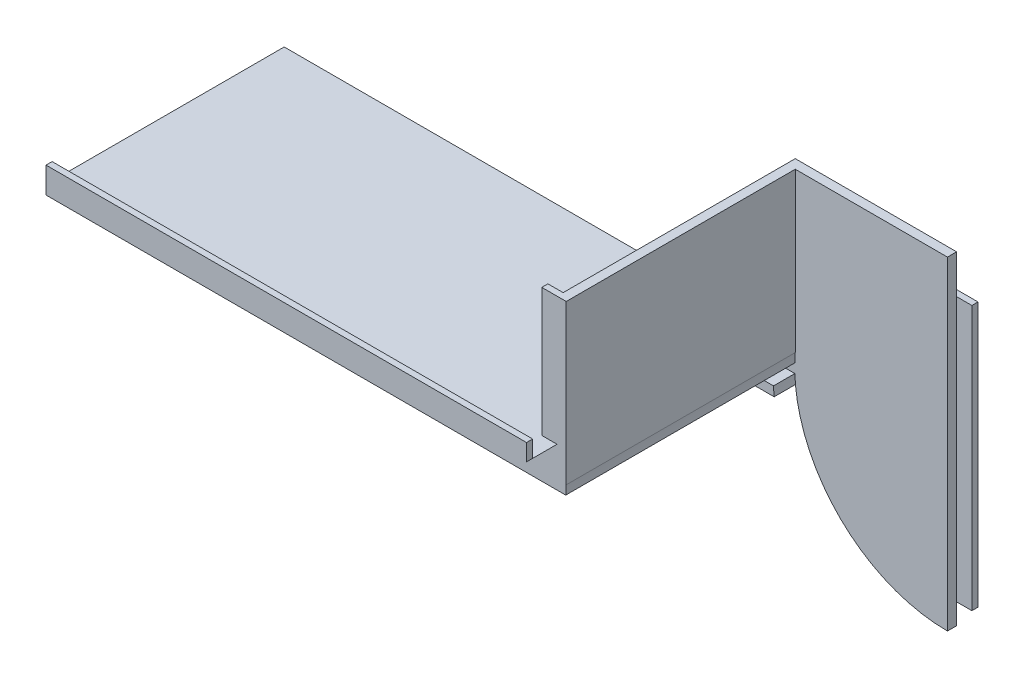
ISO-10303-21;
HEADER;
FILE_DESCRIPTION(('STEP AP214'),'2;1');
FILE_NAME('part.step','',(''),(''),'','','');
FILE_SCHEMA(('AUTOMOTIVE_DESIGN { 1 0 10303 214 1 1 1 1 }'));
ENDSEC;
DATA;
#1=APPLICATION_CONTEXT('core data for automotive mechanical design processes');
#2=APPLICATION_PROTOCOL_DEFINITION('international standard','automotive_design',2000,#1);
#3=PRODUCT_CONTEXT('',#1,'mechanical');
#4=PRODUCT('Part','Part','',(#3));
#5=PRODUCT_RELATED_PRODUCT_CATEGORY('part','',(#4));
#6=PRODUCT_DEFINITION_FORMATION('','',#4);
#7=PRODUCT_DEFINITION_CONTEXT('part definition',#1,'design');
#8=PRODUCT_DEFINITION('design','',#6,#7);
#9=PRODUCT_DEFINITION_SHAPE('','',#8);
#10=(LENGTH_UNIT() NAMED_UNIT(*) SI_UNIT(.MILLI.,.METRE.));
#11=(NAMED_UNIT(*) PLANE_ANGLE_UNIT() SI_UNIT($,.RADIAN.));
#12=(NAMED_UNIT(*) SI_UNIT($,.STERADIAN.) SOLID_ANGLE_UNIT());
#13=UNCERTAINTY_MEASURE_WITH_UNIT(LENGTH_MEASURE(1.E-05),#10,'distance_accuracy_value','');
#14=(GEOMETRIC_REPRESENTATION_CONTEXT(3) GLOBAL_UNCERTAINTY_ASSIGNED_CONTEXT((#13)) GLOBAL_UNIT_ASSIGNED_CONTEXT((#10,
#11,#12)) REPRESENTATION_CONTEXT('',''));
#15=CARTESIAN_POINT('',(0.,0.,0.));
#16=DIRECTION('',(0.,0.,1.));
#17=DIRECTION('',(1.,0.,0.));
#18=AXIS2_PLACEMENT_3D('',#15,#16,#17);
#19=CARTESIAN_POINT('',(0.,0.,-131.));
#20=DIRECTION('',(0.,0.,1.));
#21=DIRECTION('',(1.,0.,0.));
#22=AXIS2_PLACEMENT_3D('',#19,#20,#21);
#23=CYLINDRICAL_SURFACE('',#22,50.);
#24=DIRECTION('',(0.,0.,1.));
#25=VECTOR('',#24,1.);
#26=CARTESIAN_POINT('',(-49.749371855331,-5.,-131.));
#27=LINE('',#26,#25);
#28=CARTESIAN_POINT('',(-49.749371855331,-5.,-128.));
#29=VERTEX_POINT('',#28);
#30=CARTESIAN_POINT('',(-49.749371855331,-5.,-121.));
#31=VERTEX_POINT('',#30);
#32=EDGE_CURVE('E233',#29,#31,#27,.T.);
#33=ORIENTED_EDGE('',*,*,#32,.F.);
#34=CARTESIAN_POINT('',(0.,0.,-128.));
#35=DIRECTION('',(0.,0.,-1.));
#36=DIRECTION('',(-1.,0.,0.));
#37=AXIS2_PLACEMENT_3D('',#34,#35,#36);
#38=CIRCLE('',#37,50.);
#39=CARTESIAN_POINT('',(-49.9599839871872,-2.,-128.));
#40=VERTEX_POINT('',#39);
#41=EDGE_CURVE('E230',#40,#29,#38,.F.);
#42=ORIENTED_EDGE('',*,*,#41,.F.);
#43=DIRECTION('',(0.,0.,1.));
#44=VECTOR('',#43,1.);
#45=CARTESIAN_POINT('',(-49.9599839871872,-2.,-131.));
#46=LINE('',#45,#44);
#47=CARTESIAN_POINT('',(-49.9599839871872,-2.,-121.));
#48=VERTEX_POINT('',#47);
#49=EDGE_CURVE('E247',#40,#48,#46,.T.);
#50=ORIENTED_EDGE('',*,*,#49,.T.);
#51=CARTESIAN_POINT('',(0.,0.,-121.));
#52=DIRECTION('',(0.,0.,-1.));
#53=DIRECTION('',(1.,0.,0.));
#54=AXIS2_PLACEMENT_3D('',#51,#52,#53);
#55=CIRCLE('',#54,50.);
#56=EDGE_CURVE('E281',#31,#48,#55,.T.);
#57=ORIENTED_EDGE('',*,*,#56,.F.);
#58=EDGE_LOOP('',(#33,#42,#50,#57));
#59=FACE_BOUND('',#58,.T.);
#60=ADVANCED_FACE('F44',(#59),#23,.F.);
#61=CARTESIAN_POINT('',(0.,0.,-272.562777593547));
#62=DIRECTION('',(0.,0.,1.));
#63=DIRECTION('',(1.,0.,0.));
#64=AXIS2_PLACEMENT_3D('',#61,#62,#63);
#65=CYLINDRICAL_SURFACE('',#64,50.05);
#66=CARTESIAN_POINT('',(0.,0.,-128.));
#67=DIRECTION('',(0.,0.,-1.));
#68=DIRECTION('',(-1.,0.,0.));
#69=AXIS2_PLACEMENT_3D('',#66,#67,#68);
#70=CIRCLE('',#69,50.05);
#71=CARTESIAN_POINT('',(-49.7996234925526,-5.,-128.));
#72=VERTEX_POINT('',#71);
#73=CARTESIAN_POINT('',(0.,-50.05,-128.));
#74=VERTEX_POINT('',#73);
#75=EDGE_CURVE('E212',#72,#74,#70,.F.);
#76=ORIENTED_EDGE('',*,*,#75,.F.);
#77=DIRECTION('',(0.,0.,1.));
#78=VECTOR('',#77,1.);
#79=CARTESIAN_POINT('',(-49.7996234925526,-5.,-272.562777593547));
#80=LINE('',#79,#78);
#81=CARTESIAN_POINT('',(-49.7996234925526,-5.,-131.));
#82=VERTEX_POINT('',#81);
#83=EDGE_CURVE('E217',#72,#82,#80,.F.);
#84=ORIENTED_EDGE('',*,*,#83,.T.);
#85=CARTESIAN_POINT('',(0.,0.,-131.));
#86=DIRECTION('',(0.,0.,-1.));
#87=DIRECTION('',(-1.,0.,0.));
#88=AXIS2_PLACEMENT_3D('',#85,#86,#87);
#89=CIRCLE('',#88,50.05);
#90=CARTESIAN_POINT('',(0.,-50.05,-131.));
#91=VERTEX_POINT('',#90);
#92=EDGE_CURVE('E223',#91,#82,#89,.T.);
#93=ORIENTED_EDGE('',*,*,#92,.F.);
#94=DIRECTION('',(0.,0.,1.));
#95=VECTOR('',#94,1.);
#96=CARTESIAN_POINT('',(0.,-50.05,-272.562777593547));
#97=LINE('',#96,#95);
#98=EDGE_CURVE('E220',#91,#74,#97,.T.);
#99=ORIENTED_EDGE('',*,*,#98,.T.);
#100=EDGE_LOOP('',(#76,#84,#93,#99));
#101=FACE_BOUND('',#100,.T.);
#102=ADVANCED_FACE('F214',(#101),#65,.T.);
#103=CARTESIAN_POINT('',(0.,0.,-121.));
#104=DIRECTION('',(0.,0.,1.));
#105=DIRECTION('',(1.,0.,0.));
#106=AXIS2_PLACEMENT_3D('',#103,#104,#105);
#107=PLANE('',#106);
#108=DIRECTION('',(-1.,0.,0.));
#109=VECTOR('',#108,1.);
#110=CARTESIAN_POINT('',(5.00100000000001,-5.,-121.));
#111=LINE('',#110,#109);
#112=CARTESIAN_POINT('',(-220.183732216023,-5.,-121.));
#113=VERTEX_POINT('',#112);
#114=EDGE_CURVE('E60',#31,#113,#111,.T.);
#115=ORIENTED_EDGE('',*,*,#114,.F.);
#116=ORIENTED_EDGE('',*,*,#56,.T.);
#117=DIRECTION('',(-1.,0.,0.));
#118=VECTOR('',#117,1.);
#119=CARTESIAN_POINT('',(5.00100000000001,-2.,-121.));
#120=LINE('',#119,#118);
#121=CARTESIAN_POINT('',(-220.183732216023,-2.,-121.));
#122=VERTEX_POINT('',#121);
#123=EDGE_CURVE('E253',#48,#122,#120,.T.);
#124=ORIENTED_EDGE('',*,*,#123,.T.);
#125=DIRECTION('',(0.,-1.,0.));
#126=VECTOR('',#125,1.);
#127=CARTESIAN_POINT('',(-220.183732216023,-3.,-121.));
#128=LINE('',#127,#126);
#129=EDGE_CURVE('E279',#122,#113,#128,.T.);
#130=ORIENTED_EDGE('',*,*,#129,.T.);
#131=EDGE_LOOP('',(#115,#116,#124,#130));
#132=FACE_BOUND('',#131,.T.);
#133=ADVANCED_FACE('F464',(#132),#107,.T.);
#134=CARTESIAN_POINT('',(-52.8397431775085,341.294854205715,134.));
#135=DIRECTION('',(1.,0.,0.));
#136=DIRECTION('',(0.,0.,-1.));
#137=AXIS2_PLACEMENT_3D('',#134,#135,#136);
#138=PLANE('',#137);
#139=DIRECTION('',(0.,-1.,0.));
#140=VECTOR('',#139,1.);
#141=CARTESIAN_POINT('',(-52.8397431775085,56.,-55.));
#142=LINE('',#141,#140);
#143=CARTESIAN_POINT('',(-52.8397431775085,56.,-55.));
#144=VERTEX_POINT('',#143);
#145=CARTESIAN_POINT('',(-52.8397431775085,14.0000000000001,-55.));
#146=VERTEX_POINT('',#145);
#147=EDGE_CURVE('E68',#144,#146,#142,.T.);
#148=ORIENTED_EDGE('',*,*,#147,.F.);
#149=DIRECTION('',(0.,0.,-1.));
#150=VECTOR('',#149,1.);
#151=CARTESIAN_POINT('',(-52.8397431775085,56.,134.));
#152=LINE('',#151,#150);
#153=CARTESIAN_POINT('',(-52.8397431775085,56.,-131.));
#154=VERTEX_POINT('',#153);
#155=EDGE_CURVE('E372',#144,#154,#152,.T.);
#156=ORIENTED_EDGE('',*,*,#155,.T.);
#157=DIRECTION('',(0.,-1.,0.));
#158=VECTOR('',#157,1.);
#159=CARTESIAN_POINT('',(-52.8397431775085,341.294854205715,-131.));
#160=LINE('',#159,#158);
#161=CARTESIAN_POINT('',(-52.8397431775085,14.0000000000001,-131.));
#162=VERTEX_POINT('',#161);
#163=EDGE_CURVE('E384',#154,#162,#160,.T.);
#164=ORIENTED_EDGE('',*,*,#163,.T.);
#165=DIRECTION('',(0.,0.,1.));
#166=VECTOR('',#165,1.);
#167=CARTESIAN_POINT('',(-52.8397431775085,14.0000000000001,-11.5));
#168=LINE('',#167,#166);
#169=EDGE_CURVE('E399',#162,#146,#168,.T.);
#170=ORIENTED_EDGE('',*,*,#169,.T.);
#171=EDGE_LOOP('',(#148,#156,#164,#170));
#172=FACE_BOUND('',#171,.T.);
#173=ADVANCED_FACE('F466',(#172),#138,.F.);
#174=CARTESIAN_POINT('',(0.,4.,0.));
#175=DIRECTION('',(0.,-1.,0.));
#176=DIRECTION('',(0.,0.,-1.));
#177=AXIS2_PLACEMENT_3D('',#174,#175,#176);
#178=PLANE('',#177);
#179=DIRECTION('',(0.,0.,1.));
#180=VECTOR('',#179,1.);
#181=CARTESIAN_POINT('',(-220.183732216023,4.,-9.99999999999999));
#182=LINE('',#181,#180);
#183=CARTESIAN_POINT('',(-220.183732216023,4.,-131.));
#184=VERTEX_POINT('',#183);
#185=CARTESIAN_POINT('',(-220.183732216023,4.,-55.));
#186=VERTEX_POINT('',#185);
#187=EDGE_CURVE('E397',#184,#186,#182,.T.);
#188=ORIENTED_EDGE('',*,*,#187,.T.);
#189=DIRECTION('',(1.,0.,0.));
#190=VECTOR('',#189,1.);
#191=CARTESIAN_POINT('',(0.,4.,-55.));
#192=LINE('',#191,#190);
#193=CARTESIAN_POINT('',(-62.8397431775084,4.,-55.));
#194=VERTEX_POINT('',#193);
#195=EDGE_CURVE('E300',#186,#194,#192,.T.);
#196=ORIENTED_EDGE('',*,*,#195,.T.);
#197=DIRECTION('',(0.,0.,-1.));
#198=VECTOR('',#197,1.);
#199=CARTESIAN_POINT('',(-62.8397431775084,4.,-131.));
#200=LINE('',#199,#198);
#201=CARTESIAN_POINT('',(-62.8397431775084,4.,-131.));
#202=VERTEX_POINT('',#201);
#203=EDGE_CURVE('E401',#194,#202,#200,.T.);
#204=ORIENTED_EDGE('',*,*,#203,.T.);
#205=DIRECTION('',(-1.,0.,0.));
#206=VECTOR('',#205,1.);
#207=CARTESIAN_POINT('',(-39.7994974842648,4.,-131.));
#208=LINE('',#207,#206);
#209=EDGE_CURVE('E392',#202,#184,#208,.T.);
#210=ORIENTED_EDGE('',*,*,#209,.T.);
#211=EDGE_LOOP('',(#188,#196,#204,#210));
#212=FACE_BOUND('',#211,.T.);
#213=ADVANCED_FACE('F473',(#212),#178,.F.);
#214=DIRECTION('',(0.,0.,1.));
#215=VECTOR('',#214,1.);
#216=CARTESIAN_POINT('',(-49.8397431775085,4.,-131.));
#217=LINE('',#216,#215);
#218=CARTESIAN_POINT('',(-49.8397431775085,4.,-53.));
#219=VERTEX_POINT('',#218);
#220=CARTESIAN_POINT('',(-49.8397431775085,4.,-128.));
#221=VERTEX_POINT('',#220);
#222=EDGE_CURVE('E383',#219,#221,#217,.F.);
#223=ORIENTED_EDGE('',*,*,#222,.F.);
#224=CARTESIAN_POINT('',(0.,0.,-53.));
#225=DIRECTION('',(0.,0.,-1.));
#226=DIRECTION('',(0.,1.,0.));
#227=AXIS2_PLACEMENT_3D('',#224,#225,#226);
#228=CIRCLE('',#227,50.);
#229=CARTESIAN_POINT('',(-49.9899989998,1.,-53.));
#230=VERTEX_POINT('',#229);
#231=EDGE_CURVE('E307',#219,#230,#228,.F.);
#232=ORIENTED_EDGE('',*,*,#231,.T.);
#233=DIRECTION('',(0.,0.,1.));
#234=VECTOR('',#233,1.);
#235=CARTESIAN_POINT('',(-49.9899989998,1.,-131.));
#236=LINE('',#235,#234);
#237=CARTESIAN_POINT('',(-49.9899989998,1.,-128.));
#238=VERTEX_POINT('',#237);
#239=EDGE_CURVE('E324',#230,#238,#236,.F.);
#240=ORIENTED_EDGE('',*,*,#239,.T.);
#241=EDGE_CURVE('E371',#221,#238,#38,.F.);
#242=ORIENTED_EDGE('',*,*,#241,.F.);
#243=EDGE_LOOP('',(#223,#232,#240,#242));
#244=FACE_BOUND('',#243,.T.);
#245=ADVANCED_FACE('F445',(#244),#23,.F.);
#246=CARTESIAN_POINT('',(-49.8397431775085,341.294854205715,131.));
#247=DIRECTION('',(-1.,0.,0.));
#248=DIRECTION('',(0.,0.,1.));
#249=AXIS2_PLACEMENT_3D('',#246,#247,#248);
#250=PLANE('',#249);
#251=DIRECTION('',(0.,0.,1.));
#252=VECTOR('',#251,1.);
#253=CARTESIAN_POINT('',(-49.8397431775085,56.,131.));
#254=LINE('',#253,#252);
#255=CARTESIAN_POINT('',(-49.8397431775085,56.,-128.));
#256=VERTEX_POINT('',#255);
#257=CARTESIAN_POINT('',(-49.8397431775085,56.,-53.));
#258=VERTEX_POINT('',#257);
#259=EDGE_CURVE('E380',#256,#258,#254,.T.);
#260=ORIENTED_EDGE('',*,*,#259,.T.);
#261=DIRECTION('',(0.,-1.,0.));
#262=VECTOR('',#261,1.);
#263=CARTESIAN_POINT('',(-49.8397431775085,341.294854205715,-53.));
#264=LINE('',#263,#262);
#265=EDGE_CURVE('E310',#258,#219,#264,.T.);
#266=ORIENTED_EDGE('',*,*,#265,.T.);
#267=ORIENTED_EDGE('',*,*,#222,.T.);
#268=DIRECTION('',(0.,-1.,0.));
#269=VECTOR('',#268,1.);
#270=CARTESIAN_POINT('',(-49.8397431775085,341.294854205715,-128.));
#271=LINE('',#270,#269);
#272=EDGE_CURVE('E375',#256,#221,#271,.T.);
#273=ORIENTED_EDGE('',*,*,#272,.F.);
#274=EDGE_LOOP('',(#260,#266,#267,#273));
#275=FACE_BOUND('',#274,.T.);
#276=ADVANCED_FACE('F442',(#275),#250,.F.);
#277=CARTESIAN_POINT('',(-220.183732216023,4.,-9.99999999999999));
#278=DIRECTION('',(1.,0.,0.));
#279=DIRECTION('',(0.,0.,-1.));
#280=AXIS2_PLACEMENT_3D('',#277,#278,#279);
#281=PLANE('',#280);
#282=DIRECTION('',(0.,-1.,0.));
#283=VECTOR('',#282,1.);
#284=CARTESIAN_POINT('',(-220.183732216023,4.,-131.));
#285=LINE('',#284,#283);
#286=CARTESIAN_POINT('',(-220.183732216023,-5.,-131.));
#287=VERTEX_POINT('',#286);
#288=EDGE_CURVE('E394',#184,#287,#285,.T.);
#289=ORIENTED_EDGE('',*,*,#288,.T.);
#290=DIRECTION('',(0.,0.,-1.));
#291=VECTOR('',#290,1.);
#292=CARTESIAN_POINT('',(-220.183732216023,-5.,-121.));
#293=LINE('',#292,#291);
#294=EDGE_CURVE('E239',#113,#287,#293,.T.);
#295=ORIENTED_EDGE('',*,*,#294,.F.);
#296=ORIENTED_EDGE('',*,*,#129,.F.);
#297=DIRECTION('',(0.,0.,-1.));
#298=VECTOR('',#297,1.);
#299=CARTESIAN_POINT('',(-220.183732216023,-2.,-128.));
#300=LINE('',#299,#298);
#301=CARTESIAN_POINT('',(-220.183732216023,-2.,-128.));
#302=VERTEX_POINT('',#301);
#303=EDGE_CURVE('E246',#122,#302,#300,.T.);
#304=ORIENTED_EDGE('',*,*,#303,.T.);
#305=DIRECTION('',(0.,1.,0.));
#306=VECTOR('',#305,1.);
#307=CARTESIAN_POINT('',(-220.183732216023,-5.,-128.));
#308=LINE('',#307,#306);
#309=CARTESIAN_POINT('',(-220.183732216023,1.,-128.));
#310=VERTEX_POINT('',#309);
#311=EDGE_CURVE('E390',#302,#310,#308,.T.);
#312=ORIENTED_EDGE('',*,*,#311,.T.);
#313=DIRECTION('',(0.,0.,-1.));
#314=VECTOR('',#313,1.);
#315=CARTESIAN_POINT('',(-220.183732216023,1.,-128.));
#316=LINE('',#315,#314);
#317=CARTESIAN_POINT('',(-220.183732216023,1.,-53.));
#318=VERTEX_POINT('',#317);
#319=EDGE_CURVE('E318',#318,#310,#316,.T.);
#320=ORIENTED_EDGE('',*,*,#319,.F.);
#321=DIRECTION('',(0.,-1.,0.));
#322=VECTOR('',#321,1.);
#323=CARTESIAN_POINT('',(-220.183732216023,73.0673728266014,-53.));
#324=LINE('',#323,#322);
#325=CARTESIAN_POINT('',(-220.183732216023,9.5,-53.));
#326=VERTEX_POINT('',#325);
#327=EDGE_CURVE('E305',#326,#318,#324,.T.);
#328=ORIENTED_EDGE('',*,*,#327,.F.);
#329=DIRECTION('',(0.,0.,1.));
#330=VECTOR('',#329,1.);
#331=CARTESIAN_POINT('',(-220.183732216023,9.5,-55.));
#332=LINE('',#331,#330);
#333=CARTESIAN_POINT('',(-220.183732216023,9.5,-55.));
#334=VERTEX_POINT('',#333);
#335=EDGE_CURVE('E297',#334,#326,#332,.T.);
#336=ORIENTED_EDGE('',*,*,#335,.F.);
#337=DIRECTION('',(0.,-1.,0.));
#338=VECTOR('',#337,1.);
#339=CARTESIAN_POINT('',(-220.183732216023,2.5,-55.));
#340=LINE('',#339,#338);
#341=EDGE_CURVE('E284',#334,#186,#340,.T.);
#342=ORIENTED_EDGE('',*,*,#341,.T.);
#343=ORIENTED_EDGE('',*,*,#187,.F.);
#344=EDGE_LOOP('',(#289,#295,#296,#304,#312,#320,#328,#336,#342,#343));
#345=FACE_BOUND('',#344,.T.);
#346=ADVANCED_FACE('F453',(#345),#281,.F.);
#347=CARTESIAN_POINT('',(0.,0.,-131.));
#348=DIRECTION('',(0.,0.,-1.));
#349=DIRECTION('',(-1.,0.,0.));
#350=AXIS2_PLACEMENT_3D('',#347,#348,#349);
#351=PLANE('',#350);
#352=ORIENTED_EDGE('',*,*,#92,.T.);
#353=DIRECTION('',(-1.,0.,0.));
#354=VECTOR('',#353,1.);
#355=CARTESIAN_POINT('',(5.00100000000001,-5.,-131.));
#356=LINE('',#355,#354);
#357=EDGE_CURVE('E238',#82,#287,#356,.T.);
#358=ORIENTED_EDGE('',*,*,#357,.T.);
#359=ORIENTED_EDGE('',*,*,#288,.F.);
#360=ORIENTED_EDGE('',*,*,#209,.F.);
#361=DIRECTION('',(-0.707106781186544,-0.707106781186551,0.));
#362=VECTOR('',#361,1.);
#363=CARTESIAN_POINT('',(-52.8397431775085,14.0000000000001,-131.));
#364=LINE('',#363,#362);
#365=EDGE_CURVE('E405',#202,#162,#364,.F.);
#366=ORIENTED_EDGE('',*,*,#365,.T.);
#367=ORIENTED_EDGE('',*,*,#163,.F.);
#368=DIRECTION('',(1.,0.,0.));
#369=VECTOR('',#368,1.);
#370=CARTESIAN_POINT('',(-52.8397431775085,56.,-131.));
#371=LINE('',#370,#369);
#372=CARTESIAN_POINT('',(0.,56.,-131.));
#373=VERTEX_POINT('',#372);
#374=EDGE_CURVE('E374',#154,#373,#371,.T.);
#375=ORIENTED_EDGE('',*,*,#374,.T.);
#376=DIRECTION('',(0.,-1.,0.));
#377=VECTOR('',#376,1.);
#378=CARTESIAN_POINT('',(0.,104.286511517215,-131.));
#379=LINE('',#378,#377);
#380=CARTESIAN_POINT('',(0.,43.2830241784648,-131.));
#381=VERTEX_POINT('',#380);
#382=EDGE_CURVE('E361',#373,#381,#379,.T.);
#383=ORIENTED_EDGE('',*,*,#382,.T.);
#384=DIRECTION('',(1.,0.,0.));
#385=VECTOR('',#384,1.);
#386=CARTESIAN_POINT('',(5.,43.2830241784648,-131.));
#387=LINE('',#386,#385);
#388=CARTESIAN_POINT('',(-3.,43.2830241784648,-131.));
#389=VERTEX_POINT('',#388);
#390=EDGE_CURVE('E331',#389,#381,#387,.T.);
#391=ORIENTED_EDGE('',*,*,#390,.F.);
#392=DIRECTION('',(0.,1.,0.));
#393=VECTOR('',#392,1.);
#394=CARTESIAN_POINT('',(-3.,43.2830241784648,-131.));
#395=LINE('',#394,#393);
#396=CARTESIAN_POINT('',(-3.00000000000001,-43.2830241784648,-131.));
#397=VERTEX_POINT('',#396);
#398=EDGE_CURVE('E343',#397,#389,#395,.T.);
#399=ORIENTED_EDGE('',*,*,#398,.F.);
#400=DIRECTION('',(-1.,0.,0.));
#401=VECTOR('',#400,1.);
#402=CARTESIAN_POINT('',(5.,-43.2830241784648,-131.));
#403=LINE('',#402,#401);
#404=CARTESIAN_POINT('',(0.,-43.2830241784649,-131.));
#405=VERTEX_POINT('',#404);
#406=EDGE_CURVE('E53',#405,#397,#403,.T.);
#407=ORIENTED_EDGE('',*,*,#406,.F.);
#408=EDGE_CURVE('E360',#405,#91,#379,.T.);
#409=ORIENTED_EDGE('',*,*,#408,.T.);
#410=EDGE_LOOP('',(#352,#358,#359,#360,#366,#367,#375,#383,#391,#399,#407,#409));
#411=FACE_BOUND('',#410,.T.);
#412=ADVANCED_FACE('F430',(#411),#351,.T.);
#413=CARTESIAN_POINT('',(220.183732216023,-5.,-128.));
#414=DIRECTION('',(0.,0.,-1.));
#415=DIRECTION('',(-1.,0.,0.));
#416=AXIS2_PLACEMENT_3D('',#413,#414,#415);
#417=PLANE('',#416);
#418=ORIENTED_EDGE('',*,*,#41,.T.);
#419=DIRECTION('',(1.,0.,0.));
#420=VECTOR('',#419,1.);
#421=CARTESIAN_POINT('',(-53.091204109623,-5.,-128.));
#422=LINE('',#421,#420);
#423=EDGE_CURVE('E227',#72,#29,#422,.T.);
#424=ORIENTED_EDGE('',*,*,#423,.F.);
#425=ORIENTED_EDGE('',*,*,#75,.T.);
#426=DIRECTION('',(0.,1.,0.));
#427=VECTOR('',#426,1.);
#428=CARTESIAN_POINT('',(0.,-5.,-128.));
#429=LINE('',#428,#427);
#430=CARTESIAN_POINT('',(0.,56.,-128.));
#431=VERTEX_POINT('',#430);
#432=EDGE_CURVE('E364',#74,#431,#429,.T.);
#433=ORIENTED_EDGE('',*,*,#432,.T.);
#434=DIRECTION('',(-1.,0.,0.));
#435=VECTOR('',#434,1.);
#436=CARTESIAN_POINT('',(-49.8397431775085,56.,-128.));
#437=LINE('',#436,#435);
#438=EDGE_CURVE('E378',#431,#256,#437,.T.);
#439=ORIENTED_EDGE('',*,*,#438,.T.);
#440=ORIENTED_EDGE('',*,*,#272,.T.);
#441=ORIENTED_EDGE('',*,*,#241,.T.);
#442=DIRECTION('',(-1.,0.,0.));
#443=VECTOR('',#442,1.);
#444=CARTESIAN_POINT('',(5.,1.,-128.));
#445=LINE('',#444,#443);
#446=EDGE_CURVE('E321',#238,#310,#445,.T.);
#447=ORIENTED_EDGE('',*,*,#446,.T.);
#448=ORIENTED_EDGE('',*,*,#311,.F.);
#449=DIRECTION('',(-1.,0.,0.));
#450=VECTOR('',#449,1.);
#451=CARTESIAN_POINT('',(5.00100000000001,-2.,-128.));
#452=LINE('',#451,#450);
#453=EDGE_CURVE('E250',#40,#302,#452,.T.);
#454=ORIENTED_EDGE('',*,*,#453,.F.);
#455=EDGE_LOOP('',(#418,#424,#425,#433,#439,#440,#441,#447,#448,#454));
#456=FACE_BOUND('',#455,.T.);
#457=ADVANCED_FACE('F228',(#456),#417,.F.);
#458=CARTESIAN_POINT('',(42.9502503121069,56.,234.437492999377));
#459=DIRECTION('',(0.,-1.,0.));
#460=DIRECTION('',(0.,0.,-1.));
#461=AXIS2_PLACEMENT_3D('',#458,#459,#460);
#462=PLANE('',#461);
#463=ORIENTED_EDGE('',*,*,#155,.F.);
#464=DIRECTION('',(1.,0.,0.));
#465=VECTOR('',#464,1.);
#466=CARTESIAN_POINT('',(-57.8397431775085,56.,-55.));
#467=LINE('',#466,#465);
#468=CARTESIAN_POINT('',(-57.8397431775085,56.,-55.));
#469=VERTEX_POINT('',#468);
#470=EDGE_CURVE('E276',#469,#144,#467,.T.);
#471=ORIENTED_EDGE('',*,*,#470,.F.);
#472=DIRECTION('',(0.,0.,-1.));
#473=VECTOR('',#472,1.);
#474=CARTESIAN_POINT('',(-57.8397431775085,56.,-53.));
#475=LINE('',#474,#473);
#476=CARTESIAN_POINT('',(-57.8397431775085,56.,-53.));
#477=VERTEX_POINT('',#476);
#478=EDGE_CURVE('E260',#477,#469,#475,.T.);
#479=ORIENTED_EDGE('',*,*,#478,.F.);
#480=DIRECTION('',(1.,0.,0.));
#481=VECTOR('',#480,1.);
#482=CARTESIAN_POINT('',(42.9502503121069,56.,-53.));
#483=LINE('',#482,#481);
#484=EDGE_CURVE('E313',#477,#258,#483,.T.);
#485=ORIENTED_EDGE('',*,*,#484,.T.);
#486=ORIENTED_EDGE('',*,*,#259,.F.);
#487=ORIENTED_EDGE('',*,*,#438,.F.);
#488=DIRECTION('',(0.,0.,-1.));
#489=VECTOR('',#488,1.);
#490=CARTESIAN_POINT('',(0.,56.,234.437492999377));
#491=LINE('',#490,#489);
#492=EDGE_CURVE('E224',#431,#373,#491,.T.);
#493=ORIENTED_EDGE('',*,*,#492,.T.);
#494=ORIENTED_EDGE('',*,*,#374,.F.);
#495=EDGE_LOOP('',(#463,#471,#479,#485,#486,#487,#493,#494));
#496=FACE_BOUND('',#495,.T.);
#497=ADVANCED_FACE('F439',(#496),#462,.F.);
#498=CARTESIAN_POINT('',(-52.8397431775085,14.0000000000001,134.));
#499=DIRECTION('',(-0.707106781186551,0.707106781186544,0.));
#500=DIRECTION('',(0.,0.,-1.));
#501=AXIS2_PLACEMENT_3D('',#498,#499,#500);
#502=PLANE('',#501);
#503=CARTESIAN_POINT('',(-62.8397431775084,4.,-53.));
#504=VERTEX_POINT('',#503);
#505=EDGE_CURVE('E402',#504,#194,#200,.T.);
#506=ORIENTED_EDGE('',*,*,#505,.F.);
#507=DIRECTION('',(-0.707106781186544,-0.707106781186551,0.));
#508=VECTOR('',#507,1.);
#509=CARTESIAN_POINT('',(-52.8397431775085,14.0000000000001,-53.));
#510=LINE('',#509,#508);
#511=CARTESIAN_POINT('',(-52.8397431775085,14.0000000000001,-53.));
#512=VERTEX_POINT('',#511);
#513=EDGE_CURVE('E316',#504,#512,#510,.F.);
#514=ORIENTED_EDGE('',*,*,#513,.T.);
#515=DIRECTION('',(0.,0.,1.));
#516=VECTOR('',#515,1.);
#517=CARTESIAN_POINT('',(-52.8397431775085,14.0000000000001,-53.));
#518=LINE('',#517,#516);
#519=EDGE_CURVE('E261',#146,#512,#518,.T.);
#520=ORIENTED_EDGE('',*,*,#519,.F.);
#521=ORIENTED_EDGE('',*,*,#169,.F.);
#522=ORIENTED_EDGE('',*,*,#365,.F.);
#523=ORIENTED_EDGE('',*,*,#203,.F.);
#524=EDGE_LOOP('',(#506,#514,#520,#521,#522,#523));
#525=FACE_BOUND('',#524,.T.);
#526=ADVANCED_FACE('F47',(#525),#502,.T.);
#527=CARTESIAN_POINT('',(0.,104.286511517215,-131.));
#528=DIRECTION('',(-1.,0.,0.));
#529=DIRECTION('',(0.,0.,1.));
#530=AXIS2_PLACEMENT_3D('',#527,#528,#529);
#531=PLANE('',#530);
#532=ORIENTED_EDGE('',*,*,#432,.F.);
#533=ORIENTED_EDGE('',*,*,#98,.F.);
#534=ORIENTED_EDGE('',*,*,#408,.F.);
#535=EDGE_CURVE('E365',#381,#405,#379,.T.);
#536=ORIENTED_EDGE('',*,*,#535,.F.);
#537=ORIENTED_EDGE('',*,*,#382,.F.);
#538=ORIENTED_EDGE('',*,*,#492,.F.);
#539=EDGE_LOOP('',(#532,#533,#534,#536,#537,#538));
#540=FACE_BOUND('',#539,.T.);
#541=ADVANCED_FACE('F431',(#540),#531,.F.);
#542=CARTESIAN_POINT('',(5.,-43.2830241784648,-133.));
#543=DIRECTION('',(-1.,0.,0.));
#544=DIRECTION('',(0.,0.,1.));
#545=AXIS2_PLACEMENT_3D('',#542,#543,#544);
#546=PLANE('',#545);
#547=DIRECTION('',(0.,-1.,0.));
#548=VECTOR('',#547,1.);
#549=CARTESIAN_POINT('',(5.,-43.2830241784648,-131.));
#550=LINE('',#549,#548);
#551=CARTESIAN_POINT('',(5.,43.2830241784648,-131.));
#552=VERTEX_POINT('',#551);
#553=CARTESIAN_POINT('',(5.,-43.2830241784648,-131.));
#554=VERTEX_POINT('',#553);
#555=EDGE_CURVE('E326',#552,#554,#550,.T.);
#556=ORIENTED_EDGE('',*,*,#555,.T.);
#557=DIRECTION('',(0.,0.,1.));
#558=VECTOR('',#557,1.);
#559=CARTESIAN_POINT('',(5.,-43.2830241784648,-133.));
#560=LINE('',#559,#558);
#561=CARTESIAN_POINT('',(5.,-43.2830241784648,-133.));
#562=VERTEX_POINT('',#561);
#563=EDGE_CURVE('E357',#562,#554,#560,.T.);
#564=ORIENTED_EDGE('',*,*,#563,.F.);
#565=DIRECTION('',(0.,-1.,0.));
#566=VECTOR('',#565,1.);
#567=CARTESIAN_POINT('',(5.,-43.2830241784648,-133.));
#568=LINE('',#567,#566);
#569=CARTESIAN_POINT('',(5.,43.2830241784648,-133.));
#570=VERTEX_POINT('',#569);
#571=EDGE_CURVE('E327',#570,#562,#568,.T.);
#572=ORIENTED_EDGE('',*,*,#571,.F.);
#573=DIRECTION('',(0.,0.,1.));
#574=VECTOR('',#573,1.);
#575=CARTESIAN_POINT('',(5.,43.2830241784648,-133.));
#576=LINE('',#575,#574);
#577=EDGE_CURVE('E337',#570,#552,#576,.T.);
#578=ORIENTED_EDGE('',*,*,#577,.T.);
#579=EDGE_LOOP('',(#556,#564,#572,#578));
#580=FACE_BOUND('',#579,.T.);
#581=ADVANCED_FACE('F424',(#580),#546,.F.);
#582=CARTESIAN_POINT('',(5.,-43.2830241784648,-133.));
#583=DIRECTION('',(0.,1.,0.));
#584=DIRECTION('',(0.,0.,1.));
#585=AXIS2_PLACEMENT_3D('',#582,#583,#584);
#586=PLANE('',#585);
#587=EDGE_CURVE('E340',#554,#405,#403,.T.);
#588=ORIENTED_EDGE('',*,*,#587,.T.);
#589=ORIENTED_EDGE('',*,*,#406,.T.);
#590=DIRECTION('',(0.,0.,1.));
#591=VECTOR('',#590,1.);
#592=CARTESIAN_POINT('',(-3.00000000000001,-43.2830241784648,-133.));
#593=LINE('',#592,#591);
#594=CARTESIAN_POINT('',(-3.00000000000001,-43.2830241784648,-133.));
#595=VERTEX_POINT('',#594);
#596=EDGE_CURVE('E354',#595,#397,#593,.T.);
#597=ORIENTED_EDGE('',*,*,#596,.F.);
#598=DIRECTION('',(-1.,0.,0.));
#599=VECTOR('',#598,1.);
#600=CARTESIAN_POINT('',(5.,-43.2830241784648,-133.));
#601=LINE('',#600,#599);
#602=EDGE_CURVE('E330',#562,#595,#601,.T.);
#603=ORIENTED_EDGE('',*,*,#602,.F.);
#604=ORIENTED_EDGE('',*,*,#563,.T.);
#605=EDGE_LOOP('',(#588,#589,#597,#603,#604));
#606=FACE_BOUND('',#605,.T.);
#607=ADVANCED_FACE('F409',(#606),#586,.F.);
#608=CARTESIAN_POINT('',(-3.,43.2830241784648,-133.));
#609=DIRECTION('',(1.,0.,0.));
#610=DIRECTION('',(0.,1.,0.));
#611=AXIS2_PLACEMENT_3D('',#608,#609,#610);
#612=PLANE('',#611);
#613=ORIENTED_EDGE('',*,*,#398,.T.);
#614=DIRECTION('',(0.,0.,1.));
#615=VECTOR('',#614,1.);
#616=CARTESIAN_POINT('',(-3.,43.2830241784648,-133.));
#617=LINE('',#616,#615);
#618=CARTESIAN_POINT('',(-3.,43.2830241784648,-133.));
#619=VERTEX_POINT('',#618);
#620=EDGE_CURVE('E351',#619,#389,#617,.T.);
#621=ORIENTED_EDGE('',*,*,#620,.F.);
#622=DIRECTION('',(0.,1.,0.));
#623=VECTOR('',#622,1.);
#624=CARTESIAN_POINT('',(-3.,43.2830241784648,-133.));
#625=LINE('',#624,#623);
#626=EDGE_CURVE('E333',#595,#619,#625,.T.);
#627=ORIENTED_EDGE('',*,*,#626,.F.);
#628=ORIENTED_EDGE('',*,*,#596,.T.);
#629=EDGE_LOOP('',(#613,#621,#627,#628));
#630=FACE_BOUND('',#629,.T.);
#631=ADVANCED_FACE('F414',(#630),#612,.F.);
#632=CARTESIAN_POINT('',(5.,43.2830241784648,-133.));
#633=DIRECTION('',(0.,-1.,0.));
#634=DIRECTION('',(0.,0.,-1.));
#635=AXIS2_PLACEMENT_3D('',#632,#633,#634);
#636=PLANE('',#635);
#637=ORIENTED_EDGE('',*,*,#390,.T.);
#638=EDGE_CURVE('E346',#381,#552,#387,.T.);
#639=ORIENTED_EDGE('',*,*,#638,.T.);
#640=ORIENTED_EDGE('',*,*,#577,.F.);
#641=DIRECTION('',(1.,0.,0.));
#642=VECTOR('',#641,1.);
#643=CARTESIAN_POINT('',(5.,43.2830241784648,-133.));
#644=LINE('',#643,#642);
#645=EDGE_CURVE('E335',#619,#570,#644,.T.);
#646=ORIENTED_EDGE('',*,*,#645,.F.);
#647=ORIENTED_EDGE('',*,*,#620,.T.);
#648=EDGE_LOOP('',(#637,#639,#640,#646,#647));
#649=FACE_BOUND('',#648,.T.);
#650=ADVANCED_FACE('F639',(#649),#636,.F.);
#651=CARTESIAN_POINT('',(0.,0.,-133.));
#652=DIRECTION('',(0.,0.,1.));
#653=DIRECTION('',(1.,0.,0.));
#654=AXIS2_PLACEMENT_3D('',#651,#652,#653);
#655=PLANE('',#654);
#656=ORIENTED_EDGE('',*,*,#571,.T.);
#657=ORIENTED_EDGE('',*,*,#602,.T.);
#658=ORIENTED_EDGE('',*,*,#626,.T.);
#659=ORIENTED_EDGE('',*,*,#645,.T.);
#660=EDGE_LOOP('',(#656,#657,#658,#659));
#661=FACE_BOUND('',#660,.T.);
#662=ADVANCED_FACE('F418',(#661),#655,.F.);
#663=CARTESIAN_POINT('',(0.,0.,-131.));
#664=DIRECTION('',(0.,0.,1.));
#665=DIRECTION('',(1.,0.,0.));
#666=AXIS2_PLACEMENT_3D('',#663,#664,#665);
#667=PLANE('',#666);
#668=ORIENTED_EDGE('',*,*,#638,.F.);
#669=ORIENTED_EDGE('',*,*,#535,.T.);
#670=ORIENTED_EDGE('',*,*,#587,.F.);
#671=ORIENTED_EDGE('',*,*,#555,.F.);
#672=EDGE_LOOP('',(#668,#669,#670,#671));
#673=FACE_BOUND('',#672,.T.);
#674=ADVANCED_FACE('F427',(#673),#667,.T.);
#675=CARTESIAN_POINT('',(5.,1.,-128.));
#676=DIRECTION('',(0.,1.,0.));
#677=DIRECTION('',(0.,0.,1.));
#678=AXIS2_PLACEMENT_3D('',#675,#676,#677);
#679=PLANE('',#678);
#680=ORIENTED_EDGE('',*,*,#239,.F.);
#681=DIRECTION('',(-1.,0.,0.));
#682=VECTOR('',#681,1.);
#683=CARTESIAN_POINT('',(5.,1.,-53.));
#684=LINE('',#683,#682);
#685=EDGE_CURVE('E13',#230,#318,#684,.T.);
#686=ORIENTED_EDGE('',*,*,#685,.T.);
#687=ORIENTED_EDGE('',*,*,#319,.T.);
#688=ORIENTED_EDGE('',*,*,#446,.F.);
#689=EDGE_LOOP('',(#680,#686,#687,#688));
#690=FACE_BOUND('',#689,.T.);
#691=ADVANCED_FACE('F450',(#690),#679,.F.);
#692=CARTESIAN_POINT('',(132.816267783977,73.0673728266014,-53.));
#693=DIRECTION('',(0.,0.,-1.));
#694=DIRECTION('',(0.,1.,0.));
#695=AXIS2_PLACEMENT_3D('',#692,#693,#694);
#696=PLANE('',#695);
#697=ORIENTED_EDGE('',*,*,#513,.F.);
#698=DIRECTION('',(0.,1.,0.));
#699=VECTOR('',#698,1.);
#700=CARTESIAN_POINT('',(-62.8397431775084,2.5,-53.));
#701=LINE('',#700,#699);
#702=CARTESIAN_POINT('',(-62.8397431775084,9.5,-53.));
#703=VERTEX_POINT('',#702);
#704=EDGE_CURVE('E283',#504,#703,#701,.T.);
#705=ORIENTED_EDGE('',*,*,#704,.T.);
#706=DIRECTION('',(-1.,0.,0.));
#707=VECTOR('',#706,1.);
#708=CARTESIAN_POINT('',(-220.183732216023,9.5,-53.));
#709=LINE('',#708,#707);
#710=EDGE_CURVE('E288',#703,#326,#709,.T.);
#711=ORIENTED_EDGE('',*,*,#710,.T.);
#712=ORIENTED_EDGE('',*,*,#327,.T.);
#713=ORIENTED_EDGE('',*,*,#685,.F.);
#714=ORIENTED_EDGE('',*,*,#231,.F.);
#715=ORIENTED_EDGE('',*,*,#265,.F.);
#716=ORIENTED_EDGE('',*,*,#484,.F.);
#717=DIRECTION('',(0.,1.,0.));
#718=VECTOR('',#717,1.);
#719=CARTESIAN_POINT('',(-57.8397431775085,56.,-53.));
#720=LINE('',#719,#718);
#721=CARTESIAN_POINT('',(-57.8397431775085,14.0000000000001,-53.));
#722=VERTEX_POINT('',#721);
#723=EDGE_CURVE('E257',#722,#477,#720,.T.);
#724=ORIENTED_EDGE('',*,*,#723,.F.);
#725=DIRECTION('',(1.,0.,0.));
#726=VECTOR('',#725,1.);
#727=CARTESIAN_POINT('',(-57.8397431775085,14.0000000000001,-53.));
#728=LINE('',#727,#726);
#729=EDGE_CURVE('E267',#722,#512,#728,.T.);
#730=ORIENTED_EDGE('',*,*,#729,.T.);
#731=EDGE_LOOP('',(#697,#705,#711,#712,#713,#714,#715,#716,#724,#730));
#732=FACE_BOUND('',#731,.T.);
#733=ADVANCED_FACE('F561',(#732),#696,.F.);
#734=CARTESIAN_POINT('',(0.,0.,-55.));
#735=DIRECTION('',(0.,0.,-1.));
#736=DIRECTION('',(-1.,0.,0.));
#737=AXIS2_PLACEMENT_3D('',#734,#735,#736);
#738=PLANE('',#737);
#739=ORIENTED_EDGE('',*,*,#195,.F.);
#740=ORIENTED_EDGE('',*,*,#341,.F.);
#741=DIRECTION('',(-1.,0.,0.));
#742=VECTOR('',#741,1.);
#743=CARTESIAN_POINT('',(-220.183732216023,9.5,-55.));
#744=LINE('',#743,#742);
#745=CARTESIAN_POINT('',(-62.8397431775084,9.5,-55.));
#746=VERTEX_POINT('',#745);
#747=EDGE_CURVE('E290',#746,#334,#744,.T.);
#748=ORIENTED_EDGE('',*,*,#747,.F.);
#749=DIRECTION('',(0.,1.,0.));
#750=VECTOR('',#749,1.);
#751=CARTESIAN_POINT('',(-62.8397431775084,2.5,-55.));
#752=LINE('',#751,#750);
#753=EDGE_CURVE('E287',#194,#746,#752,.T.);
#754=ORIENTED_EDGE('',*,*,#753,.F.);
#755=EDGE_LOOP('',(#739,#740,#748,#754));
#756=FACE_BOUND('',#755,.T.);
#757=ADVANCED_FACE('F564',(#756),#738,.T.);
#758=CARTESIAN_POINT('',(-62.8397431775084,2.5,-55.));
#759=DIRECTION('',(1.,0.,0.));
#760=DIRECTION('',(0.,0.,-1.));
#761=AXIS2_PLACEMENT_3D('',#758,#759,#760);
#762=PLANE('',#761);
#763=ORIENTED_EDGE('',*,*,#505,.T.);
#764=ORIENTED_EDGE('',*,*,#753,.T.);
#765=DIRECTION('',(0.,0.,1.));
#766=VECTOR('',#765,1.);
#767=CARTESIAN_POINT('',(-62.8397431775084,9.5,-55.));
#768=LINE('',#767,#766);
#769=EDGE_CURVE('E293',#746,#703,#768,.T.);
#770=ORIENTED_EDGE('',*,*,#769,.T.);
#771=ORIENTED_EDGE('',*,*,#704,.F.);
#772=EDGE_LOOP('',(#763,#764,#770,#771));
#773=FACE_BOUND('',#772,.T.);
#774=ADVANCED_FACE('F595',(#773),#762,.T.);
#775=CARTESIAN_POINT('',(-220.183732216023,9.5,-55.));
#776=DIRECTION('',(0.,1.,0.));
#777=DIRECTION('',(0.,0.,1.));
#778=AXIS2_PLACEMENT_3D('',#775,#776,#777);
#779=PLANE('',#778);
#780=ORIENTED_EDGE('',*,*,#710,.F.);
#781=ORIENTED_EDGE('',*,*,#769,.F.);
#782=ORIENTED_EDGE('',*,*,#747,.T.);
#783=ORIENTED_EDGE('',*,*,#335,.T.);
#784=EDGE_LOOP('',(#780,#781,#782,#783));
#785=FACE_BOUND('',#784,.T.);
#786=ADVANCED_FACE('F553',(#785),#779,.T.);
#787=CARTESIAN_POINT('',(-57.8397431775085,56.,-55.));
#788=DIRECTION('',(0.,0.,1.));
#789=DIRECTION('',(1.,0.,0.));
#790=AXIS2_PLACEMENT_3D('',#787,#788,#789);
#791=PLANE('',#790);
#792=ORIENTED_EDGE('',*,*,#147,.T.);
#793=DIRECTION('',(1.,0.,0.));
#794=VECTOR('',#793,1.);
#795=CARTESIAN_POINT('',(-57.8397431775085,14.0000000000001,-55.));
#796=LINE('',#795,#794);
#797=CARTESIAN_POINT('',(-57.8397431775085,14.0000000000001,-55.));
#798=VERTEX_POINT('',#797);
#799=EDGE_CURVE('E273',#798,#146,#796,.T.);
#800=ORIENTED_EDGE('',*,*,#799,.F.);
#801=DIRECTION('',(0.,-1.,0.));
#802=VECTOR('',#801,1.);
#803=CARTESIAN_POINT('',(-57.8397431775085,56.,-55.));
#804=LINE('',#803,#802);
#805=EDGE_CURVE('E263',#469,#798,#804,.T.);
#806=ORIENTED_EDGE('',*,*,#805,.F.);
#807=ORIENTED_EDGE('',*,*,#470,.T.);
#808=EDGE_LOOP('',(#792,#800,#806,#807));
#809=FACE_BOUND('',#808,.T.);
#810=ADVANCED_FACE('F542',(#809),#791,.F.);
#811=CARTESIAN_POINT('',(-57.8397431775085,14.0000000000001,-53.));
#812=DIRECTION('',(0.,1.,0.));
#813=DIRECTION('',(0.,0.,1.));
#814=AXIS2_PLACEMENT_3D('',#811,#812,#813);
#815=PLANE('',#814);
#816=ORIENTED_EDGE('',*,*,#519,.T.);
#817=ORIENTED_EDGE('',*,*,#729,.F.);
#818=DIRECTION('',(0.,0.,1.));
#819=VECTOR('',#818,1.);
#820=CARTESIAN_POINT('',(-57.8397431775085,14.0000000000001,-53.));
#821=LINE('',#820,#819);
#822=EDGE_CURVE('E265',#798,#722,#821,.T.);
#823=ORIENTED_EDGE('',*,*,#822,.F.);
#824=ORIENTED_EDGE('',*,*,#799,.T.);
#825=EDGE_LOOP('',(#816,#817,#823,#824));
#826=FACE_BOUND('',#825,.T.);
#827=ADVANCED_FACE('F531',(#826),#815,.F.);
#828=CARTESIAN_POINT('',(-57.8397431775085,0.,0.));
#829=DIRECTION('',(1.,0.,0.));
#830=DIRECTION('',(0.,0.,-1.));
#831=AXIS2_PLACEMENT_3D('',#828,#829,#830);
#832=PLANE('',#831);
#833=ORIENTED_EDGE('',*,*,#723,.T.);
#834=ORIENTED_EDGE('',*,*,#478,.T.);
#835=ORIENTED_EDGE('',*,*,#805,.T.);
#836=ORIENTED_EDGE('',*,*,#822,.T.);
#837=EDGE_LOOP('',(#833,#834,#835,#836));
#838=FACE_BOUND('',#837,.T.);
#839=ADVANCED_FACE('F521',(#838),#832,.F.);
#840=CARTESIAN_POINT('',(5.00100000000001,-2.,-128.));
#841=DIRECTION('',(0.,1.,0.));
#842=DIRECTION('',(0.,0.,1.));
#843=AXIS2_PLACEMENT_3D('',#840,#841,#842);
#844=PLANE('',#843);
#845=ORIENTED_EDGE('',*,*,#49,.F.);
#846=ORIENTED_EDGE('',*,*,#453,.T.);
#847=ORIENTED_EDGE('',*,*,#303,.F.);
#848=ORIENTED_EDGE('',*,*,#123,.F.);
#849=EDGE_LOOP('',(#845,#846,#847,#848));
#850=FACE_BOUND('',#849,.T.);
#851=ADVANCED_FACE('F459',(#850),#844,.T.);
#852=CARTESIAN_POINT('',(5.00100000000001,-5.,-121.));
#853=DIRECTION('',(0.,1.,0.));
#854=DIRECTION('',(0.,0.,1.));
#855=AXIS2_PLACEMENT_3D('',#852,#853,#854);
#856=PLANE('',#855);
#857=ORIENTED_EDGE('',*,*,#114,.T.);
#858=ORIENTED_EDGE('',*,*,#294,.T.);
#859=ORIENTED_EDGE('',*,*,#357,.F.);
#860=ORIENTED_EDGE('',*,*,#83,.F.);
#861=ORIENTED_EDGE('',*,*,#423,.T.);
#862=ORIENTED_EDGE('',*,*,#32,.T.);
#863=EDGE_LOOP('',(#857,#858,#859,#860,#861,#862));
#864=FACE_BOUND('',#863,.T.);
#865=ADVANCED_FACE('F236',(#864),#856,.F.);
#866=CLOSED_SHELL('',(#60,#102,#133,#173,#213,#245,#276,#346,#412,#457,#497,#526,#541,#581,#607,
#631,#650,#662,#674,#691,#733,#757,#774,#786,#810,#827,#839,#851,#865));
#867=MANIFOLD_SOLID_BREP('B2',#866);
#868=ADVANCED_BREP_SHAPE_REPRESENTATION('',(#18,#867),#14);
#869=SHAPE_DEFINITION_REPRESENTATION(#9,#868);
ENDSEC;
END-ISO-10303-21;
